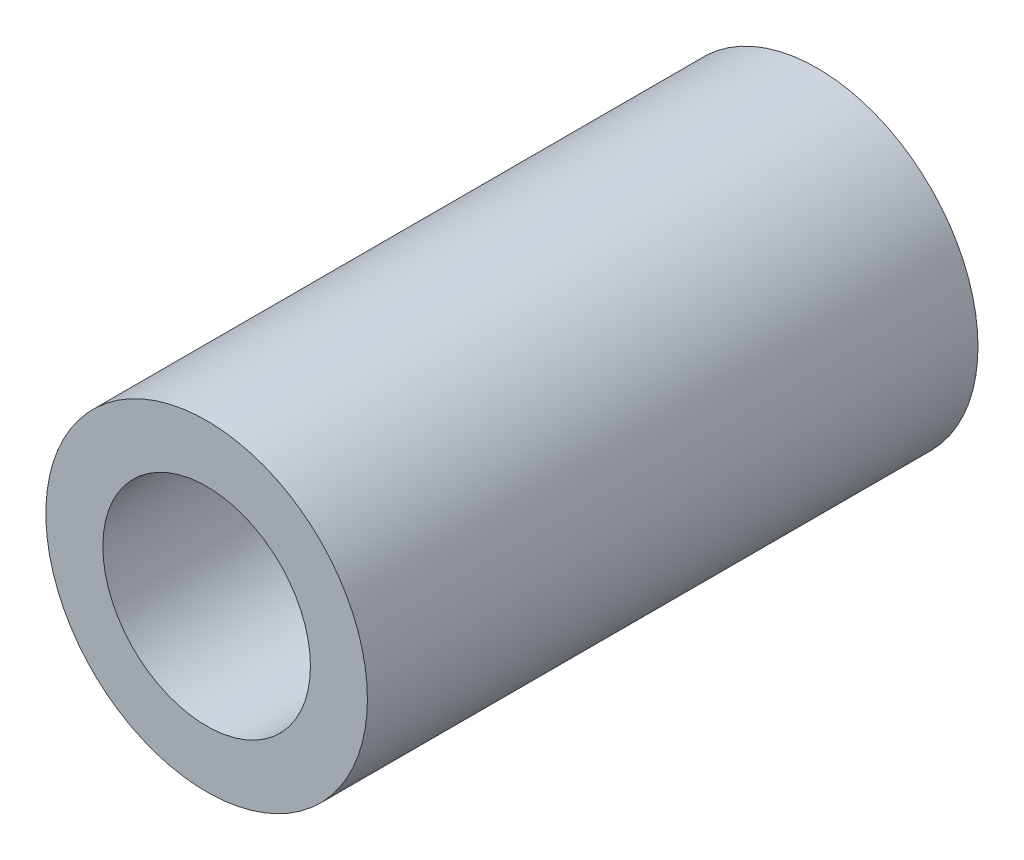
ISO-10303-21;
HEADER;
FILE_DESCRIPTION(('STEP AP214'),'2;1');
FILE_NAME('part.step','',(''),(''),'','','');
FILE_SCHEMA(('AUTOMOTIVE_DESIGN { 1 0 10303 214 1 1 1 1 }'));
ENDSEC;
DATA;
#1=APPLICATION_CONTEXT('core data for automotive mechanical design processes');
#2=APPLICATION_PROTOCOL_DEFINITION('international standard','automotive_design',2000,#1);
#3=PRODUCT_CONTEXT('',#1,'mechanical');
#4=PRODUCT('Part','Part','',(#3));
#5=PRODUCT_RELATED_PRODUCT_CATEGORY('part','',(#4));
#6=PRODUCT_DEFINITION_FORMATION('','',#4);
#7=PRODUCT_DEFINITION_CONTEXT('part definition',#1,'design');
#8=PRODUCT_DEFINITION('design','',#6,#7);
#9=PRODUCT_DEFINITION_SHAPE('','',#8);
#10=(LENGTH_UNIT() NAMED_UNIT(*) SI_UNIT(.MILLI.,.METRE.));
#11=(NAMED_UNIT(*) PLANE_ANGLE_UNIT() SI_UNIT($,.RADIAN.));
#12=(NAMED_UNIT(*) SI_UNIT($,.STERADIAN.) SOLID_ANGLE_UNIT());
#13=UNCERTAINTY_MEASURE_WITH_UNIT(LENGTH_MEASURE(1.E-05),#10,'distance_accuracy_value','');
#14=(GEOMETRIC_REPRESENTATION_CONTEXT(3) GLOBAL_UNCERTAINTY_ASSIGNED_CONTEXT((#13)) GLOBAL_UNIT_ASSIGNED_CONTEXT((#10,
#11,#12)) REPRESENTATION_CONTEXT('',''));
#15=CARTESIAN_POINT('',(0.,0.,0.));
#16=DIRECTION('',(0.,0.,1.));
#17=DIRECTION('',(1.,0.,0.));
#18=AXIS2_PLACEMENT_3D('',#15,#16,#17);
#19=CARTESIAN_POINT('',(0.,0.,0.));
#20=DIRECTION('',(0.,0.,1.));
#21=DIRECTION('',(1.,0.,0.));
#22=AXIS2_PLACEMENT_3D('',#19,#20,#21);
#23=PLANE('',#22);
#24=CARTESIAN_POINT('',(0.,0.,0.));
#25=DIRECTION('',(0.,0.,1.));
#26=DIRECTION('',(1.,0.,0.));
#27=AXIS2_PLACEMENT_3D('',#24,#25,#26);
#28=CIRCLE('',#27,2.55);
#29=CARTESIAN_POINT('',(2.55,0.,0.));
#30=VERTEX_POINT('',#29);
#31=EDGE_CURVE('E51',#30,#30,#28,.T.);
#32=ORIENTED_EDGE('',*,*,#31,.T.);
#33=EDGE_LOOP('',(#32));
#34=FACE_BOUND('',#33,.T.);
#35=CARTESIAN_POINT('',(0.,0.,0.));
#36=DIRECTION('',(0.,0.,1.));
#37=DIRECTION('',(1.,0.,0.));
#38=AXIS2_PLACEMENT_3D('',#35,#36,#37);
#39=CIRCLE('',#38,2.7);
#40=CARTESIAN_POINT('',(2.7,0.,0.));
#41=VERTEX_POINT('',#40);
#42=EDGE_CURVE('E10',#41,#41,#39,.T.);
#43=ORIENTED_EDGE('',*,*,#42,.F.);
#44=EDGE_LOOP('',(#43));
#45=FACE_BOUND('',#44,.T.);
#46=ADVANCED_FACE('F35',(#34,#45),#23,.F.);
#47=CARTESIAN_POINT('',(0.,0.,7.));
#48=DIRECTION('',(0.,0.,-1.));
#49=DIRECTION('',(-1.,0.,0.));
#50=AXIS2_PLACEMENT_3D('',#47,#48,#49);
#51=CYLINDRICAL_SURFACE('',#50,3.95);
#52=CARTESIAN_POINT('',(0.,0.,7.));
#53=DIRECTION('',(0.,0.,1.));
#54=DIRECTION('',(1.,0.,0.));
#55=AXIS2_PLACEMENT_3D('',#52,#53,#54);
#56=CIRCLE('',#55,3.95);
#57=CARTESIAN_POINT('',(3.95,0.,7.));
#58=VERTEX_POINT('',#57);
#59=EDGE_CURVE('E46',#58,#58,#56,.T.);
#60=ORIENTED_EDGE('',*,*,#59,.F.);
#61=EDGE_LOOP('',(#60));
#62=FACE_BOUND('',#61,.T.);
#63=CARTESIAN_POINT('',(0.,0.,-8.));
#64=DIRECTION('',(0.,0.,1.));
#65=DIRECTION('',(1.,0.,0.));
#66=AXIS2_PLACEMENT_3D('',#63,#64,#65);
#67=CIRCLE('',#66,3.95);
#68=CARTESIAN_POINT('',(3.95,0.,-8.));
#69=VERTEX_POINT('',#68);
#70=EDGE_CURVE('E55',#69,#69,#67,.T.);
#71=ORIENTED_EDGE('',*,*,#70,.T.);
#72=EDGE_LOOP('',(#71));
#73=FACE_BOUND('',#72,.T.);
#74=ADVANCED_FACE('F37',(#62,#73),#51,.T.);
#75=CARTESIAN_POINT('',(0.,0.,7.));
#76=DIRECTION('',(0.,0.,-1.));
#77=DIRECTION('',(-1.,0.,0.));
#78=AXIS2_PLACEMENT_3D('',#75,#76,#77);
#79=CYLINDRICAL_SURFACE('',#78,2.55);
#80=CARTESIAN_POINT('',(0.,0.,7.));
#81=DIRECTION('',(0.,0.,1.));
#82=DIRECTION('',(1.,0.,0.));
#83=AXIS2_PLACEMENT_3D('',#80,#81,#82);
#84=CIRCLE('',#83,2.55);
#85=CARTESIAN_POINT('',(2.55,0.,7.));
#86=VERTEX_POINT('',#85);
#87=EDGE_CURVE('E42',#86,#86,#84,.T.);
#88=ORIENTED_EDGE('',*,*,#87,.T.);
#89=EDGE_LOOP('',(#88));
#90=FACE_BOUND('',#89,.T.);
#91=ORIENTED_EDGE('',*,*,#31,.F.);
#92=EDGE_LOOP('',(#91));
#93=FACE_BOUND('',#92,.T.);
#94=ADVANCED_FACE('F78',(#90,#93),#79,.F.);
#95=CARTESIAN_POINT('',(0.,0.,7.));
#96=DIRECTION('',(0.,0.,1.));
#97=DIRECTION('',(1.,0.,0.));
#98=AXIS2_PLACEMENT_3D('',#95,#96,#97);
#99=PLANE('',#98);
#100=ORIENTED_EDGE('',*,*,#59,.T.);
#101=EDGE_LOOP('',(#100));
#102=FACE_BOUND('',#101,.T.);
#103=ORIENTED_EDGE('',*,*,#87,.F.);
#104=EDGE_LOOP('',(#103));
#105=FACE_BOUND('',#104,.T.);
#106=ADVANCED_FACE('F71',(#102,#105),#99,.T.);
#107=CARTESIAN_POINT('',(0.,0.,-8.));
#108=DIRECTION('',(0.,0.,1.));
#109=DIRECTION('',(1.,0.,0.));
#110=AXIS2_PLACEMENT_3D('',#107,#108,#109);
#111=CYLINDRICAL_SURFACE('',#110,2.7);
#112=CARTESIAN_POINT('',(0.,0.,-8.));
#113=DIRECTION('',(0.,0.,1.));
#114=DIRECTION('',(1.,0.,0.));
#115=AXIS2_PLACEMENT_3D('',#112,#113,#114);
#116=CIRCLE('',#115,2.7);
#117=CARTESIAN_POINT('',(2.7,0.,-8.));
#118=VERTEX_POINT('',#117);
#119=EDGE_CURVE('E59',#118,#118,#116,.T.);
#120=ORIENTED_EDGE('',*,*,#119,.F.);
#121=EDGE_LOOP('',(#120));
#122=FACE_BOUND('',#121,.T.);
#123=ORIENTED_EDGE('',*,*,#42,.T.);
#124=EDGE_LOOP('',(#123));
#125=FACE_BOUND('',#124,.T.);
#126=ADVANCED_FACE('F69',(#122,#125),#111,.F.);
#127=CARTESIAN_POINT('',(0.,0.,-8.));
#128=DIRECTION('',(0.,0.,1.));
#129=DIRECTION('',(1.,0.,0.));
#130=AXIS2_PLACEMENT_3D('',#127,#128,#129);
#131=PLANE('',#130);
#132=ORIENTED_EDGE('',*,*,#119,.T.);
#133=EDGE_LOOP('',(#132));
#134=FACE_BOUND('',#133,.T.);
#135=ORIENTED_EDGE('',*,*,#70,.F.);
#136=EDGE_LOOP('',(#135));
#137=FACE_BOUND('',#136,.T.);
#138=ADVANCED_FACE('F66',(#134,#137),#131,.F.);
#139=CLOSED_SHELL('',(#46,#74,#94,#106,#126,#138));
#140=MANIFOLD_SOLID_BREP('B2',#139);
#141=ADVANCED_BREP_SHAPE_REPRESENTATION('',(#18,#140),#14);
#142=SHAPE_DEFINITION_REPRESENTATION(#9,#141);
ENDSEC;
END-ISO-10303-21;
